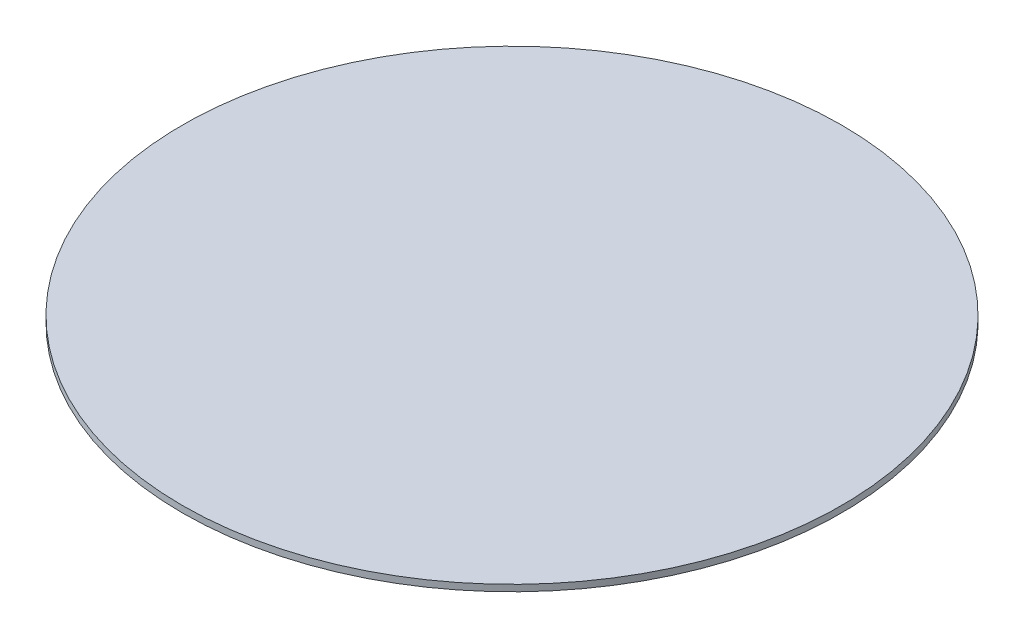
ISO-10303-21;
HEADER;
FILE_DESCRIPTION(('STEP AP214'),'2;1');
FILE_NAME('part.step','',(''),(''),'','','');
FILE_SCHEMA(('AUTOMOTIVE_DESIGN { 1 0 10303 214 1 1 1 1 }'));
ENDSEC;
DATA;
#1=APPLICATION_CONTEXT('core data for automotive mechanical design processes');
#2=APPLICATION_PROTOCOL_DEFINITION('international standard','automotive_design',2000,#1);
#3=PRODUCT_CONTEXT('',#1,'mechanical');
#4=PRODUCT('Part','Part','',(#3));
#5=PRODUCT_RELATED_PRODUCT_CATEGORY('part','',(#4));
#6=PRODUCT_DEFINITION_FORMATION('','',#4);
#7=PRODUCT_DEFINITION_CONTEXT('part definition',#1,'design');
#8=PRODUCT_DEFINITION('design','',#6,#7);
#9=PRODUCT_DEFINITION_SHAPE('','',#8);
#10=(LENGTH_UNIT() NAMED_UNIT(*) SI_UNIT(.MILLI.,.METRE.));
#11=(NAMED_UNIT(*) PLANE_ANGLE_UNIT() SI_UNIT($,.RADIAN.));
#12=(NAMED_UNIT(*) SI_UNIT($,.STERADIAN.) SOLID_ANGLE_UNIT());
#13=UNCERTAINTY_MEASURE_WITH_UNIT(LENGTH_MEASURE(1.E-05),#10,'distance_accuracy_value','');
#14=(GEOMETRIC_REPRESENTATION_CONTEXT(3) GLOBAL_UNCERTAINTY_ASSIGNED_CONTEXT((#13)) GLOBAL_UNIT_ASSIGNED_CONTEXT((#10,
#11,#12)) REPRESENTATION_CONTEXT('',''));
#15=CARTESIAN_POINT('',(0.,0.,0.));
#16=DIRECTION('',(0.,0.,1.));
#17=DIRECTION('',(1.,0.,0.));
#18=AXIS2_PLACEMENT_3D('',#15,#16,#17);
#19=CARTESIAN_POINT('',(0.,3.175,0.));
#20=DIRECTION('',(0.,-1.,0.));
#21=DIRECTION('',(0.,0.,-1.));
#22=AXIS2_PLACEMENT_3D('',#19,#20,#21);
#23=CYLINDRICAL_SURFACE('',#22,161.5);
#24=CARTESIAN_POINT('',(0.,3.175,0.));
#25=DIRECTION('',(0.,1.,0.));
#26=DIRECTION('',(0.,0.,1.));
#27=AXIS2_PLACEMENT_3D('',#24,#25,#26);
#28=CIRCLE('',#27,161.5);
#29=CARTESIAN_POINT('',(0.,3.175,161.5));
#30=VERTEX_POINT('',#29);
#31=EDGE_CURVE('E10',#30,#30,#28,.T.);
#32=ORIENTED_EDGE('',*,*,#31,.F.);
#33=EDGE_LOOP('',(#32));
#34=FACE_BOUND('',#33,.T.);
#35=CARTESIAN_POINT('',(0.,0.,0.));
#36=DIRECTION('',(0.,1.,0.));
#37=DIRECTION('',(0.,0.,1.));
#38=AXIS2_PLACEMENT_3D('',#35,#36,#37);
#39=CIRCLE('',#38,161.5);
#40=CARTESIAN_POINT('',(0.,0.,161.5));
#41=VERTEX_POINT('',#40);
#42=EDGE_CURVE('E34',#41,#41,#39,.T.);
#43=ORIENTED_EDGE('',*,*,#42,.T.);
#44=EDGE_LOOP('',(#43));
#45=FACE_BOUND('',#44,.T.);
#46=ADVANCED_FACE('F31',(#34,#45),#23,.T.);
#47=CARTESIAN_POINT('',(0.,3.175,0.));
#48=DIRECTION('',(0.,1.,0.));
#49=DIRECTION('',(0.,0.,1.));
#50=AXIS2_PLACEMENT_3D('',#47,#48,#49);
#51=PLANE('',#50);
#52=ORIENTED_EDGE('',*,*,#31,.T.);
#53=EDGE_LOOP('',(#52));
#54=FACE_BOUND('',#53,.T.);
#55=ADVANCED_FACE('F46',(#54),#51,.T.);
#56=CARTESIAN_POINT('',(0.,0.,0.));
#57=DIRECTION('',(0.,1.,0.));
#58=DIRECTION('',(0.,0.,1.));
#59=AXIS2_PLACEMENT_3D('',#56,#57,#58);
#60=PLANE('',#59);
#61=ORIENTED_EDGE('',*,*,#42,.F.);
#62=EDGE_LOOP('',(#61));
#63=FACE_BOUND('',#62,.T.);
#64=ADVANCED_FACE('F44',(#63),#60,.F.);
#65=CLOSED_SHELL('',(#46,#55,#64));
#66=MANIFOLD_SOLID_BREP('B2',#65);
#67=ADVANCED_BREP_SHAPE_REPRESENTATION('',(#18,#66),#14);
#68=SHAPE_DEFINITION_REPRESENTATION(#9,#67);
ENDSEC;
END-ISO-10303-21;
